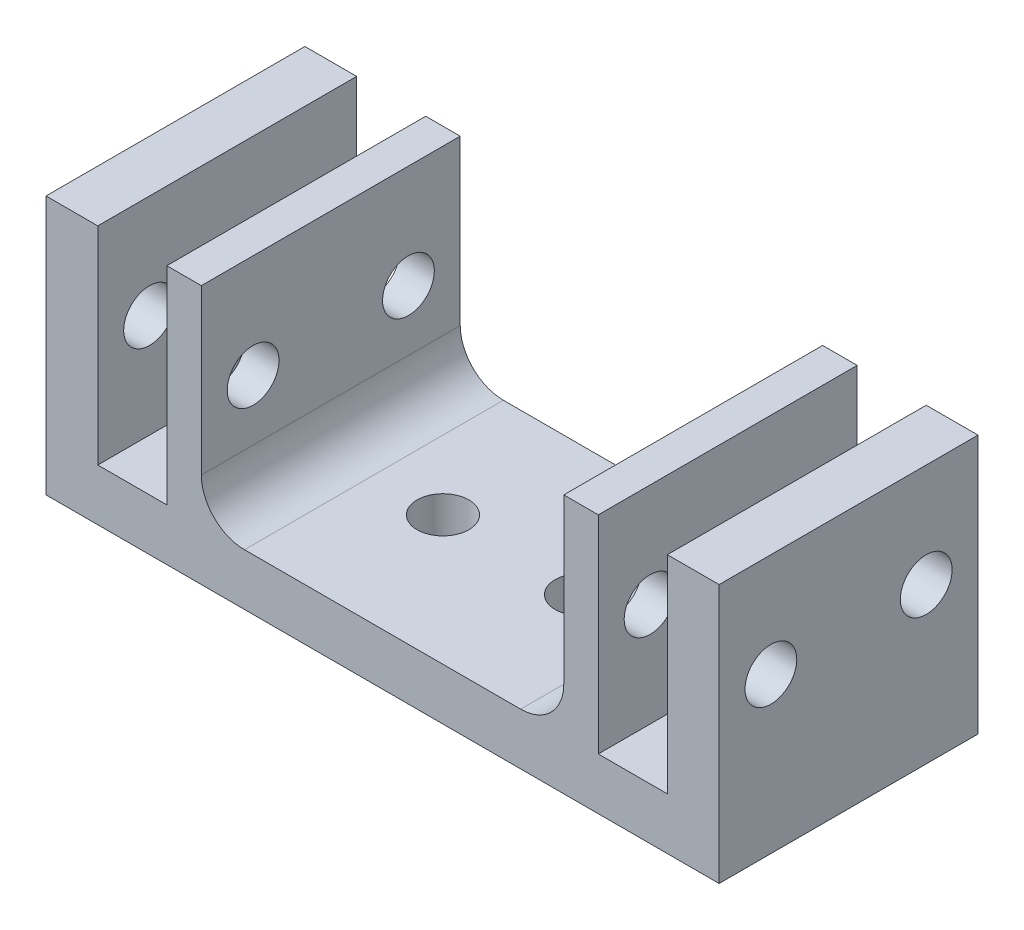
ISO-10303-21;
HEADER;
FILE_DESCRIPTION(('STEP AP214'),'2;1');
FILE_NAME('part.step','',(''),(''),'','','');
FILE_SCHEMA(('AUTOMOTIVE_DESIGN { 1 0 10303 214 1 1 1 1 }'));
ENDSEC;
DATA;
#1=APPLICATION_CONTEXT('core data for automotive mechanical design processes');
#2=APPLICATION_PROTOCOL_DEFINITION('international standard','automotive_design',2000,#1);
#3=PRODUCT_CONTEXT('',#1,'mechanical');
#4=PRODUCT('Part','Part','',(#3));
#5=PRODUCT_RELATED_PRODUCT_CATEGORY('part','',(#4));
#6=PRODUCT_DEFINITION_FORMATION('','',#4);
#7=PRODUCT_DEFINITION_CONTEXT('part definition',#1,'design');
#8=PRODUCT_DEFINITION('design','',#6,#7);
#9=PRODUCT_DEFINITION_SHAPE('','',#8);
#10=(LENGTH_UNIT() NAMED_UNIT(*) SI_UNIT(.MILLI.,.METRE.));
#11=(NAMED_UNIT(*) PLANE_ANGLE_UNIT() SI_UNIT($,.RADIAN.));
#12=(NAMED_UNIT(*) SI_UNIT($,.STERADIAN.) SOLID_ANGLE_UNIT());
#13=UNCERTAINTY_MEASURE_WITH_UNIT(LENGTH_MEASURE(1.E-05),#10,'distance_accuracy_value','');
#14=(GEOMETRIC_REPRESENTATION_CONTEXT(3) GLOBAL_UNCERTAINTY_ASSIGNED_CONTEXT((#13)) GLOBAL_UNIT_ASSIGNED_CONTEXT((#10,
#11,#12)) REPRESENTATION_CONTEXT('',''));
#15=CARTESIAN_POINT('',(0.,0.,0.));
#16=DIRECTION('',(0.,0.,1.));
#17=DIRECTION('',(1.,0.,0.));
#18=AXIS2_PLACEMENT_3D('',#15,#16,#17);
#19=CARTESIAN_POINT('',(-19.5,0.,15.));
#20=DIRECTION('',(1.,0.,0.));
#21=DIRECTION('',(0.,0.,-1.));
#22=AXIS2_PLACEMENT_3D('',#19,#20,#21);
#23=PLANE('',#22);
#24=CARTESIAN_POINT('',(-19.5,9.00000000000001,12.));
#25=DIRECTION('',(1.,0.,0.));
#26=DIRECTION('',(0.,1.,0.));
#27=AXIS2_PLACEMENT_3D('',#24,#25,#26);
#28=CIRCLE('',#27,1.5);
#29=CARTESIAN_POINT('',(-19.5,10.5,12.));
#30=VERTEX_POINT('',#29);
#31=EDGE_CURVE('E205',#30,#30,#28,.T.);
#32=ORIENTED_EDGE('',*,*,#31,.T.);
#33=EDGE_LOOP('',(#32));
#34=FACE_BOUND('',#33,.T.);
#35=CARTESIAN_POINT('',(-19.5,9.00000000000001,3.));
#36=DIRECTION('',(1.,0.,0.));
#37=DIRECTION('',(0.,-1.,0.));
#38=AXIS2_PLACEMENT_3D('',#35,#36,#37);
#39=CIRCLE('',#38,1.5);
#40=CARTESIAN_POINT('',(-19.5,7.50000000000001,3.));
#41=VERTEX_POINT('',#40);
#42=EDGE_CURVE('E552',#41,#41,#39,.T.);
#43=ORIENTED_EDGE('',*,*,#42,.T.);
#44=EDGE_LOOP('',(#43));
#45=FACE_BOUND('',#44,.T.);
#46=DIRECTION('',(0.,-1.,0.));
#47=VECTOR('',#46,1.);
#48=CARTESIAN_POINT('',(-19.5,0.,0.));
#49=LINE('',#48,#47);
#50=CARTESIAN_POINT('',(-19.5,15.,0.));
#51=VERTEX_POINT('',#50);
#52=CARTESIAN_POINT('',(-19.5,0.,0.));
#53=VERTEX_POINT('',#52);
#54=EDGE_CURVE('E188',#51,#53,#49,.T.);
#55=ORIENTED_EDGE('',*,*,#54,.T.);
#56=DIRECTION('',(0.,0.,-1.));
#57=VECTOR('',#56,1.);
#58=CARTESIAN_POINT('',(-19.5,0.,15.));
#59=LINE('',#58,#57);
#60=CARTESIAN_POINT('',(-19.5,0.,15.));
#61=VERTEX_POINT('',#60);
#62=EDGE_CURVE('E168',#61,#53,#59,.T.);
#63=ORIENTED_EDGE('',*,*,#62,.F.);
#64=DIRECTION('',(0.,-1.,0.));
#65=VECTOR('',#64,1.);
#66=CARTESIAN_POINT('',(-19.5,0.,15.));
#67=LINE('',#66,#65);
#68=CARTESIAN_POINT('',(-19.5,15.,15.));
#69=VERTEX_POINT('',#68);
#70=EDGE_CURVE('E175',#69,#61,#67,.T.);
#71=ORIENTED_EDGE('',*,*,#70,.F.);
#72=DIRECTION('',(0.,0.,-1.));
#73=VECTOR('',#72,1.);
#74=CARTESIAN_POINT('',(-19.5,15.,15.));
#75=LINE('',#74,#73);
#76=EDGE_CURVE('E271',#69,#51,#75,.T.);
#77=ORIENTED_EDGE('',*,*,#76,.T.);
#78=EDGE_LOOP('',(#55,#63,#71,#77));
#79=FACE_BOUND('',#78,.T.);
#80=ADVANCED_FACE('F39',(#34,#45,#79),#23,.F.);
#81=CARTESIAN_POINT('',(19.5,0.,15.));
#82=DIRECTION('',(0.,1.,0.));
#83=DIRECTION('',(0.,0.,1.));
#84=AXIS2_PLACEMENT_3D('',#81,#82,#83);
#85=PLANE('',#84);
#86=CARTESIAN_POINT('',(-4.,0.,7.5));
#87=DIRECTION('',(0.,1.,0.));
#88=DIRECTION('',(0.,0.,1.));
#89=AXIS2_PLACEMENT_3D('',#86,#87,#88);
#90=CIRCLE('',#89,1.5);
#91=CARTESIAN_POINT('',(-4.,0.,9.));
#92=VERTEX_POINT('',#91);
#93=EDGE_CURVE('E275',#92,#92,#90,.T.);
#94=ORIENTED_EDGE('',*,*,#93,.T.);
#95=EDGE_LOOP('',(#94));
#96=FACE_BOUND('',#95,.T.);
#97=CARTESIAN_POINT('',(4.,0.,7.5));
#98=DIRECTION('',(0.,1.,0.));
#99=DIRECTION('',(0.,0.,1.));
#100=AXIS2_PLACEMENT_3D('',#97,#98,#99);
#101=CIRCLE('',#100,1.5);
#102=CARTESIAN_POINT('',(4.,0.,9.));
#103=VERTEX_POINT('',#102);
#104=EDGE_CURVE('E501',#103,#103,#101,.T.);
#105=ORIENTED_EDGE('',*,*,#104,.T.);
#106=EDGE_LOOP('',(#105));
#107=FACE_BOUND('',#106,.T.);
#108=DIRECTION('',(1.,0.,0.));
#109=VECTOR('',#108,1.);
#110=CARTESIAN_POINT('',(19.5,0.,0.));
#111=LINE('',#110,#109);
#112=CARTESIAN_POINT('',(19.5,0.,0.));
#113=VERTEX_POINT('',#112);
#114=EDGE_CURVE('E274',#53,#113,#111,.T.);
#115=ORIENTED_EDGE('',*,*,#114,.T.);
#116=DIRECTION('',(0.,0.,-1.));
#117=VECTOR('',#116,1.);
#118=CARTESIAN_POINT('',(19.5,0.,15.));
#119=LINE('',#118,#117);
#120=CARTESIAN_POINT('',(19.5,0.,15.));
#121=VERTEX_POINT('',#120);
#122=EDGE_CURVE('E171',#121,#113,#119,.T.);
#123=ORIENTED_EDGE('',*,*,#122,.F.);
#124=DIRECTION('',(1.,0.,0.));
#125=VECTOR('',#124,1.);
#126=CARTESIAN_POINT('',(19.5,0.,15.));
#127=LINE('',#126,#125);
#128=EDGE_CURVE('E164',#61,#121,#127,.T.);
#129=ORIENTED_EDGE('',*,*,#128,.F.);
#130=ORIENTED_EDGE('',*,*,#62,.T.);
#131=EDGE_LOOP('',(#115,#123,#129,#130));
#132=FACE_BOUND('',#131,.T.);
#133=ADVANCED_FACE('F166',(#96,#107,#132),#85,.F.);
#134=CARTESIAN_POINT('',(19.5,0.,15.));
#135=DIRECTION('',(-1.,0.,0.));
#136=DIRECTION('',(0.,0.,1.));
#137=AXIS2_PLACEMENT_3D('',#134,#135,#136);
#138=PLANE('',#137);
#139=CARTESIAN_POINT('',(19.5,9.,12.));
#140=DIRECTION('',(1.,0.,0.));
#141=DIRECTION('',(0.,1.,0.));
#142=AXIS2_PLACEMENT_3D('',#139,#140,#141);
#143=CIRCLE('',#142,1.5);
#144=CARTESIAN_POINT('',(19.5,10.5,12.));
#145=VERTEX_POINT('',#144);
#146=EDGE_CURVE('E556',#145,#145,#143,.T.);
#147=ORIENTED_EDGE('',*,*,#146,.F.);
#148=EDGE_LOOP('',(#147));
#149=FACE_BOUND('',#148,.T.);
#150=CARTESIAN_POINT('',(19.5,9.,3.));
#151=DIRECTION('',(1.,0.,0.));
#152=DIRECTION('',(0.,-1.,0.));
#153=AXIS2_PLACEMENT_3D('',#150,#151,#152);
#154=CIRCLE('',#153,1.5);
#155=CARTESIAN_POINT('',(19.5,7.5,3.));
#156=VERTEX_POINT('',#155);
#157=EDGE_CURVE('E548',#156,#156,#154,.T.);
#158=ORIENTED_EDGE('',*,*,#157,.F.);
#159=EDGE_LOOP('',(#158));
#160=FACE_BOUND('',#159,.T.);
#161=DIRECTION('',(0.,1.,0.));
#162=VECTOR('',#161,1.);
#163=CARTESIAN_POINT('',(19.5,0.,0.));
#164=LINE('',#163,#162);
#165=CARTESIAN_POINT('',(19.5,15.,0.));
#166=VERTEX_POINT('',#165);
#167=EDGE_CURVE('E278',#113,#166,#164,.T.);
#168=ORIENTED_EDGE('',*,*,#167,.T.);
#169=DIRECTION('',(0.,0.,-1.));
#170=VECTOR('',#169,1.);
#171=CARTESIAN_POINT('',(19.5,15.,15.));
#172=LINE('',#171,#170);
#173=CARTESIAN_POINT('',(19.5,15.,15.));
#174=VERTEX_POINT('',#173);
#175=EDGE_CURVE('E196',#174,#166,#172,.T.);
#176=ORIENTED_EDGE('',*,*,#175,.F.);
#177=DIRECTION('',(0.,1.,0.));
#178=VECTOR('',#177,1.);
#179=CARTESIAN_POINT('',(19.5,0.,15.));
#180=LINE('',#179,#178);
#181=EDGE_CURVE('E174',#121,#174,#180,.T.);
#182=ORIENTED_EDGE('',*,*,#181,.F.);
#183=ORIENTED_EDGE('',*,*,#122,.T.);
#184=EDGE_LOOP('',(#168,#176,#182,#183));
#185=FACE_BOUND('',#184,.T.);
#186=ADVANCED_FACE('F425',(#149,#160,#185),#138,.F.);
#187=CARTESIAN_POINT('',(19.5,15.,15.));
#188=DIRECTION('',(0.,-1.,0.));
#189=DIRECTION('',(1.,0.,0.));
#190=AXIS2_PLACEMENT_3D('',#187,#188,#189);
#191=PLANE('',#190);
#192=DIRECTION('',(-1.,0.,0.));
#193=VECTOR('',#192,1.);
#194=CARTESIAN_POINT('',(19.5,15.,0.));
#195=LINE('',#194,#193);
#196=CARTESIAN_POINT('',(16.5,15.,0.));
#197=VERTEX_POINT('',#196);
#198=EDGE_CURVE('E281',#166,#197,#195,.T.);
#199=ORIENTED_EDGE('',*,*,#198,.T.);
#200=DIRECTION('',(0.,0.,-1.));
#201=VECTOR('',#200,1.);
#202=CARTESIAN_POINT('',(16.5,15.,15.));
#203=LINE('',#202,#201);
#204=CARTESIAN_POINT('',(16.5,15.,15.));
#205=VERTEX_POINT('',#204);
#206=EDGE_CURVE('E351',#205,#197,#203,.T.);
#207=ORIENTED_EDGE('',*,*,#206,.F.);
#208=DIRECTION('',(-1.,0.,0.));
#209=VECTOR('',#208,1.);
#210=CARTESIAN_POINT('',(19.5,15.,15.));
#211=LINE('',#210,#209);
#212=EDGE_CURVE('E362',#174,#205,#211,.T.);
#213=ORIENTED_EDGE('',*,*,#212,.F.);
#214=ORIENTED_EDGE('',*,*,#175,.T.);
#215=EDGE_LOOP('',(#199,#207,#213,#214));
#216=FACE_BOUND('',#215,.T.);
#217=ADVANCED_FACE('F360',(#216),#191,.F.);
#218=CARTESIAN_POINT('',(16.5,15.,15.));
#219=DIRECTION('',(1.,0.,0.));
#220=DIRECTION('',(0.,1.,0.));
#221=AXIS2_PLACEMENT_3D('',#218,#219,#220);
#222=PLANE('',#221);
#223=CARTESIAN_POINT('',(16.5,9.,12.));
#224=DIRECTION('',(1.,0.,0.));
#225=DIRECTION('',(0.,1.,0.));
#226=AXIS2_PLACEMENT_3D('',#223,#224,#225);
#227=CIRCLE('',#226,1.5);
#228=CARTESIAN_POINT('',(16.5,10.5,12.));
#229=VERTEX_POINT('',#228);
#230=EDGE_CURVE('E492',#229,#229,#227,.T.);
#231=ORIENTED_EDGE('',*,*,#230,.T.);
#232=EDGE_LOOP('',(#231));
#233=FACE_BOUND('',#232,.T.);
#234=CARTESIAN_POINT('',(16.5,9.,3.));
#235=DIRECTION('',(1.,0.,0.));
#236=DIRECTION('',(0.,1.,0.));
#237=AXIS2_PLACEMENT_3D('',#234,#235,#236);
#238=CIRCLE('',#237,1.5);
#239=CARTESIAN_POINT('',(16.5,10.5,3.));
#240=VERTEX_POINT('',#239);
#241=EDGE_CURVE('E210',#240,#240,#238,.T.);
#242=ORIENTED_EDGE('',*,*,#241,.T.);
#243=EDGE_LOOP('',(#242));
#244=FACE_BOUND('',#243,.T.);
#245=DIRECTION('',(0.,-1.,0.));
#246=VECTOR('',#245,1.);
#247=CARTESIAN_POINT('',(16.5,15.,0.));
#248=LINE('',#247,#246);
#249=CARTESIAN_POINT('',(16.5,3.,0.));
#250=VERTEX_POINT('',#249);
#251=EDGE_CURVE('E284',#197,#250,#248,.T.);
#252=ORIENTED_EDGE('',*,*,#251,.T.);
#253=DIRECTION('',(0.,0.,-1.));
#254=VECTOR('',#253,1.);
#255=CARTESIAN_POINT('',(16.5,3.,15.));
#256=LINE('',#255,#254);
#257=CARTESIAN_POINT('',(16.5,3.,15.));
#258=VERTEX_POINT('',#257);
#259=EDGE_CURVE('E347',#258,#250,#256,.T.);
#260=ORIENTED_EDGE('',*,*,#259,.F.);
#261=DIRECTION('',(0.,-1.,0.));
#262=VECTOR('',#261,1.);
#263=CARTESIAN_POINT('',(16.5,15.,15.));
#264=LINE('',#263,#262);
#265=EDGE_CURVE('E380',#205,#258,#264,.T.);
#266=ORIENTED_EDGE('',*,*,#265,.F.);
#267=ORIENTED_EDGE('',*,*,#206,.T.);
#268=EDGE_LOOP('',(#252,#260,#266,#267));
#269=FACE_BOUND('',#268,.T.);
#270=ADVANCED_FACE('F370',(#233,#244,#269),#222,.F.);
#271=CARTESIAN_POINT('',(16.5,3.,15.));
#272=DIRECTION('',(0.,-1.,0.));
#273=DIRECTION('',(1.,0.,0.));
#274=AXIS2_PLACEMENT_3D('',#271,#272,#273);
#275=PLANE('',#274);
#276=DIRECTION('',(-1.,0.,0.));
#277=VECTOR('',#276,1.);
#278=CARTESIAN_POINT('',(16.5,3.,0.));
#279=LINE('',#278,#277);
#280=CARTESIAN_POINT('',(12.5,3.,0.));
#281=VERTEX_POINT('',#280);
#282=EDGE_CURVE('E287',#250,#281,#279,.T.);
#283=ORIENTED_EDGE('',*,*,#282,.T.);
#284=DIRECTION('',(0.,0.,-1.));
#285=VECTOR('',#284,1.);
#286=CARTESIAN_POINT('',(12.5,3.,15.));
#287=LINE('',#286,#285);
#288=CARTESIAN_POINT('',(12.5,3.,15.));
#289=VERTEX_POINT('',#288);
#290=EDGE_CURVE('E343',#289,#281,#287,.T.);
#291=ORIENTED_EDGE('',*,*,#290,.F.);
#292=DIRECTION('',(-1.,0.,0.));
#293=VECTOR('',#292,1.);
#294=CARTESIAN_POINT('',(16.5,3.,15.));
#295=LINE('',#294,#293);
#296=EDGE_CURVE('E376',#258,#289,#295,.T.);
#297=ORIENTED_EDGE('',*,*,#296,.F.);
#298=ORIENTED_EDGE('',*,*,#259,.T.);
#299=EDGE_LOOP('',(#283,#291,#297,#298));
#300=FACE_BOUND('',#299,.T.);
#301=ADVANCED_FACE('F374',(#300),#275,.F.);
#302=CARTESIAN_POINT('',(12.5,3.,15.));
#303=DIRECTION('',(-1.,0.,0.));
#304=DIRECTION('',(0.,0.,1.));
#305=AXIS2_PLACEMENT_3D('',#302,#303,#304);
#306=PLANE('',#305);
#307=CARTESIAN_POINT('',(12.5,9.,12.));
#308=DIRECTION('',(-1.,0.,0.));
#309=DIRECTION('',(0.,0.,1.));
#310=AXIS2_PLACEMENT_3D('',#307,#308,#309);
#311=CIRCLE('',#310,1.5);
#312=CARTESIAN_POINT('',(12.5,9.,13.5));
#313=VERTEX_POINT('',#312);
#314=EDGE_CURVE('E485',#313,#313,#311,.T.);
#315=ORIENTED_EDGE('',*,*,#314,.T.);
#316=EDGE_LOOP('',(#315));
#317=FACE_BOUND('',#316,.T.);
#318=CARTESIAN_POINT('',(12.5,9.,3.));
#319=DIRECTION('',(-1.,0.,0.));
#320=DIRECTION('',(0.,0.,1.));
#321=AXIS2_PLACEMENT_3D('',#318,#319,#320);
#322=CIRCLE('',#321,1.5);
#323=CARTESIAN_POINT('',(12.5,9.,4.5));
#324=VERTEX_POINT('',#323);
#325=EDGE_CURVE('E532',#324,#324,#322,.T.);
#326=ORIENTED_EDGE('',*,*,#325,.T.);
#327=EDGE_LOOP('',(#326));
#328=FACE_BOUND('',#327,.T.);
#329=DIRECTION('',(0.,1.,0.));
#330=VECTOR('',#329,1.);
#331=CARTESIAN_POINT('',(12.5,3.,0.));
#332=LINE('',#331,#330);
#333=CARTESIAN_POINT('',(12.5,15.,0.));
#334=VERTEX_POINT('',#333);
#335=EDGE_CURVE('E290',#281,#334,#332,.T.);
#336=ORIENTED_EDGE('',*,*,#335,.T.);
#337=DIRECTION('',(0.,0.,-1.));
#338=VECTOR('',#337,1.);
#339=CARTESIAN_POINT('',(12.5,15.,15.));
#340=LINE('',#339,#338);
#341=CARTESIAN_POINT('',(12.5,15.,15.));
#342=VERTEX_POINT('',#341);
#343=EDGE_CURVE('E339',#342,#334,#340,.T.);
#344=ORIENTED_EDGE('',*,*,#343,.F.);
#345=DIRECTION('',(0.,1.,0.));
#346=VECTOR('',#345,1.);
#347=CARTESIAN_POINT('',(12.5,3.,15.));
#348=LINE('',#347,#346);
#349=EDGE_CURVE('E379',#289,#342,#348,.T.);
#350=ORIENTED_EDGE('',*,*,#349,.F.);
#351=ORIENTED_EDGE('',*,*,#290,.T.);
#352=EDGE_LOOP('',(#336,#344,#350,#351));
#353=FACE_BOUND('',#352,.T.);
#354=ADVANCED_FACE('F407',(#317,#328,#353),#306,.F.);
#355=CARTESIAN_POINT('',(12.5,15.,15.));
#356=DIRECTION('',(0.,-1.,0.));
#357=DIRECTION('',(1.,0.,0.));
#358=AXIS2_PLACEMENT_3D('',#355,#356,#357);
#359=PLANE('',#358);
#360=DIRECTION('',(-1.,0.,0.));
#361=VECTOR('',#360,1.);
#362=CARTESIAN_POINT('',(12.5,15.,0.));
#363=LINE('',#362,#361);
#364=CARTESIAN_POINT('',(10.5,15.,0.));
#365=VERTEX_POINT('',#364);
#366=EDGE_CURVE('E293',#334,#365,#363,.T.);
#367=ORIENTED_EDGE('',*,*,#366,.T.);
#368=DIRECTION('',(0.,0.,-1.));
#369=VECTOR('',#368,1.);
#370=CARTESIAN_POINT('',(10.5,15.,15.));
#371=LINE('',#370,#369);
#372=CARTESIAN_POINT('',(10.5,15.,15.));
#373=VERTEX_POINT('',#372);
#374=EDGE_CURVE('E335',#373,#365,#371,.T.);
#375=ORIENTED_EDGE('',*,*,#374,.F.);
#376=DIRECTION('',(-1.,0.,0.));
#377=VECTOR('',#376,1.);
#378=CARTESIAN_POINT('',(12.5,15.,15.));
#379=LINE('',#378,#377);
#380=EDGE_CURVE('E384',#342,#373,#379,.T.);
#381=ORIENTED_EDGE('',*,*,#380,.F.);
#382=ORIENTED_EDGE('',*,*,#343,.T.);
#383=EDGE_LOOP('',(#367,#375,#381,#382));
#384=FACE_BOUND('',#383,.T.);
#385=ADVANCED_FACE('F404',(#384),#359,.F.);
#386=CARTESIAN_POINT('',(10.5,15.,15.));
#387=DIRECTION('',(1.,0.,0.));
#388=DIRECTION('',(0.,1.,0.));
#389=AXIS2_PLACEMENT_3D('',#386,#387,#388);
#390=PLANE('',#389);
#391=CARTESIAN_POINT('',(10.5,9.,12.));
#392=DIRECTION('',(1.,0.,0.));
#393=DIRECTION('',(0.,1.,0.));
#394=AXIS2_PLACEMENT_3D('',#391,#392,#393);
#395=CIRCLE('',#394,1.5);
#396=CARTESIAN_POINT('',(10.5,10.5,12.));
#397=VERTEX_POINT('',#396);
#398=EDGE_CURVE('E480',#397,#397,#395,.T.);
#399=ORIENTED_EDGE('',*,*,#398,.T.);
#400=EDGE_LOOP('',(#399));
#401=FACE_BOUND('',#400,.T.);
#402=CARTESIAN_POINT('',(10.5,9.,3.));
#403=DIRECTION('',(1.,0.,0.));
#404=DIRECTION('',(0.,1.,0.));
#405=AXIS2_PLACEMENT_3D('',#402,#403,#404);
#406=CIRCLE('',#405,1.5);
#407=CARTESIAN_POINT('',(10.5,10.5,3.));
#408=VERTEX_POINT('',#407);
#409=EDGE_CURVE('E535',#408,#408,#406,.T.);
#410=ORIENTED_EDGE('',*,*,#409,.T.);
#411=EDGE_LOOP('',(#410));
#412=FACE_BOUND('',#411,.T.);
#413=DIRECTION('',(0.,-1.,0.));
#414=VECTOR('',#413,1.);
#415=CARTESIAN_POINT('',(10.5,15.,0.));
#416=LINE('',#415,#414);
#417=CARTESIAN_POINT('',(10.5,5.5,0.));
#418=VERTEX_POINT('',#417);
#419=EDGE_CURVE('E240',#365,#418,#416,.T.);
#420=ORIENTED_EDGE('',*,*,#419,.T.);
#421=DIRECTION('',(0.,0.,-1.));
#422=VECTOR('',#421,1.);
#423=CARTESIAN_POINT('',(10.5,5.5,15.));
#424=LINE('',#423,#422);
#425=CARTESIAN_POINT('',(10.5,5.5,15.));
#426=VERTEX_POINT('',#425);
#427=EDGE_CURVE('E215',#418,#426,#424,.F.);
#428=ORIENTED_EDGE('',*,*,#427,.T.);
#429=DIRECTION('',(0.,-1.,0.));
#430=VECTOR('',#429,1.);
#431=CARTESIAN_POINT('',(10.5,15.,15.));
#432=LINE('',#431,#430);
#433=EDGE_CURVE('E257',#373,#426,#432,.T.);
#434=ORIENTED_EDGE('',*,*,#433,.F.);
#435=ORIENTED_EDGE('',*,*,#374,.T.);
#436=EDGE_LOOP('',(#420,#428,#434,#435));
#437=FACE_BOUND('',#436,.T.);
#438=ADVANCED_FACE('F402',(#401,#412,#437),#390,.F.);
#439=CARTESIAN_POINT('',(-10.5,3.,15.));
#440=DIRECTION('',(0.,-1.,0.));
#441=DIRECTION('',(0.,0.,-1.));
#442=AXIS2_PLACEMENT_3D('',#439,#440,#441);
#443=PLANE('',#442);
#444=CARTESIAN_POINT('',(-4.,3.,7.5));
#445=DIRECTION('',(0.,1.,0.));
#446=DIRECTION('',(0.,0.,1.));
#447=AXIS2_PLACEMENT_3D('',#444,#445,#446);
#448=CIRCLE('',#447,1.5);
#449=CARTESIAN_POINT('',(-4.,3.,9.));
#450=VERTEX_POINT('',#449);
#451=EDGE_CURVE('E497',#450,#450,#448,.T.);
#452=ORIENTED_EDGE('',*,*,#451,.F.);
#453=EDGE_LOOP('',(#452));
#454=FACE_BOUND('',#453,.T.);
#455=CARTESIAN_POINT('',(4.,3.,7.5));
#456=DIRECTION('',(0.,1.,0.));
#457=DIRECTION('',(0.,0.,-1.));
#458=AXIS2_PLACEMENT_3D('',#455,#456,#457);
#459=CIRCLE('',#458,1.5);
#460=CARTESIAN_POINT('',(4.,3.,6.));
#461=VERTEX_POINT('',#460);
#462=EDGE_CURVE('E496',#461,#461,#459,.T.);
#463=ORIENTED_EDGE('',*,*,#462,.F.);
#464=EDGE_LOOP('',(#463));
#465=FACE_BOUND('',#464,.T.);
#466=DIRECTION('',(-1.,0.,0.));
#467=VECTOR('',#466,1.);
#468=CARTESIAN_POINT('',(-10.5,3.,15.));
#469=LINE('',#468,#467);
#470=CARTESIAN_POINT('',(8.,3.,15.));
#471=VERTEX_POINT('',#470);
#472=CARTESIAN_POINT('',(-8.,3.,15.));
#473=VERTEX_POINT('',#472);
#474=EDGE_CURVE('E251',#471,#473,#469,.T.);
#475=ORIENTED_EDGE('',*,*,#474,.F.);
#476=DIRECTION('',(0.,0.,-1.));
#477=VECTOR('',#476,1.);
#478=CARTESIAN_POINT('',(8.,3.,0.));
#479=LINE('',#478,#477);
#480=CARTESIAN_POINT('',(8.,3.,0.));
#481=VERTEX_POINT('',#480);
#482=EDGE_CURVE('E194',#471,#481,#479,.T.);
#483=ORIENTED_EDGE('',*,*,#482,.T.);
#484=DIRECTION('',(-1.,0.,0.));
#485=VECTOR('',#484,1.);
#486=CARTESIAN_POINT('',(-10.5,3.,0.));
#487=LINE('',#486,#485);
#488=CARTESIAN_POINT('',(-8.,3.,0.));
#489=VERTEX_POINT('',#488);
#490=EDGE_CURVE('E232',#481,#489,#487,.T.);
#491=ORIENTED_EDGE('',*,*,#490,.T.);
#492=DIRECTION('',(0.,0.,-1.));
#493=VECTOR('',#492,1.);
#494=CARTESIAN_POINT('',(-8.,3.,15.));
#495=LINE('',#494,#493);
#496=EDGE_CURVE('E190',#489,#473,#495,.F.);
#497=ORIENTED_EDGE('',*,*,#496,.T.);
#498=EDGE_LOOP('',(#475,#483,#491,#497));
#499=FACE_BOUND('',#498,.T.);
#500=ADVANCED_FACE('F237',(#454,#465,#499),#443,.F.);
#501=CARTESIAN_POINT('',(-10.5,15.,15.));
#502=DIRECTION('',(-1.,0.,0.));
#503=DIRECTION('',(0.,-1.,0.));
#504=AXIS2_PLACEMENT_3D('',#501,#502,#503);
#505=PLANE('',#504);
#506=CARTESIAN_POINT('',(-10.5,9.,12.));
#507=DIRECTION('',(-1.,0.,0.));
#508=DIRECTION('',(0.,-1.,0.));
#509=AXIS2_PLACEMENT_3D('',#506,#507,#508);
#510=CIRCLE('',#509,1.5);
#511=CARTESIAN_POINT('',(-10.5,7.50000000000001,12.));
#512=VERTEX_POINT('',#511);
#513=EDGE_CURVE('E477',#512,#512,#510,.T.);
#514=ORIENTED_EDGE('',*,*,#513,.T.);
#515=EDGE_LOOP('',(#514));
#516=FACE_BOUND('',#515,.T.);
#517=CARTESIAN_POINT('',(-10.5,9.00000000000001,3.));
#518=DIRECTION('',(-1.,0.,0.));
#519=DIRECTION('',(0.,-1.,0.));
#520=AXIS2_PLACEMENT_3D('',#517,#518,#519);
#521=CIRCLE('',#520,1.5);
#522=CARTESIAN_POINT('',(-10.5,7.50000000000001,3.));
#523=VERTEX_POINT('',#522);
#524=EDGE_CURVE('E541',#523,#523,#521,.T.);
#525=ORIENTED_EDGE('',*,*,#524,.T.);
#526=EDGE_LOOP('',(#525));
#527=FACE_BOUND('',#526,.T.);
#528=DIRECTION('',(0.,1.,0.));
#529=VECTOR('',#528,1.);
#530=CARTESIAN_POINT('',(-10.5,15.,15.));
#531=LINE('',#530,#529);
#532=CARTESIAN_POINT('',(-10.5,5.5,15.));
#533=VERTEX_POINT('',#532);
#534=CARTESIAN_POINT('',(-10.5,15.,15.));
#535=VERTEX_POINT('',#534);
#536=EDGE_CURVE('E246',#533,#535,#531,.T.);
#537=ORIENTED_EDGE('',*,*,#536,.F.);
#538=DIRECTION('',(0.,0.,-1.));
#539=VECTOR('',#538,1.);
#540=CARTESIAN_POINT('',(-10.5,5.5,0.));
#541=LINE('',#540,#539);
#542=CARTESIAN_POINT('',(-10.5,5.5,0.));
#543=VERTEX_POINT('',#542);
#544=EDGE_CURVE('E218',#533,#543,#541,.T.);
#545=ORIENTED_EDGE('',*,*,#544,.T.);
#546=DIRECTION('',(0.,1.,0.));
#547=VECTOR('',#546,1.);
#548=CARTESIAN_POINT('',(-10.5,15.,0.));
#549=LINE('',#548,#547);
#550=CARTESIAN_POINT('',(-10.5,15.,0.));
#551=VERTEX_POINT('',#550);
#552=EDGE_CURVE('E234',#543,#551,#549,.T.);
#553=ORIENTED_EDGE('',*,*,#552,.T.);
#554=DIRECTION('',(0.,0.,-1.));
#555=VECTOR('',#554,1.);
#556=CARTESIAN_POINT('',(-10.5,15.,15.));
#557=LINE('',#556,#555);
#558=EDGE_CURVE('E247',#535,#551,#557,.T.);
#559=ORIENTED_EDGE('',*,*,#558,.F.);
#560=EDGE_LOOP('',(#537,#545,#553,#559));
#561=FACE_BOUND('',#560,.T.);
#562=ADVANCED_FACE('F243',(#516,#527,#561),#505,.F.);
#563=CARTESIAN_POINT('',(-12.5,15.,15.));
#564=DIRECTION('',(0.,-1.,0.));
#565=DIRECTION('',(1.,0.,0.));
#566=AXIS2_PLACEMENT_3D('',#563,#564,#565);
#567=PLANE('',#566);
#568=DIRECTION('',(-1.,0.,0.));
#569=VECTOR('',#568,1.);
#570=CARTESIAN_POINT('',(-12.5,15.,0.));
#571=LINE('',#570,#569);
#572=CARTESIAN_POINT('',(-12.5,15.,0.));
#573=VERTEX_POINT('',#572);
#574=EDGE_CURVE('E301',#551,#573,#571,.T.);
#575=ORIENTED_EDGE('',*,*,#574,.T.);
#576=DIRECTION('',(0.,0.,-1.));
#577=VECTOR('',#576,1.);
#578=CARTESIAN_POINT('',(-12.5,15.,15.));
#579=LINE('',#578,#577);
#580=CARTESIAN_POINT('',(-12.5,15.,15.));
#581=VERTEX_POINT('',#580);
#582=EDGE_CURVE('E329',#581,#573,#579,.T.);
#583=ORIENTED_EDGE('',*,*,#582,.F.);
#584=DIRECTION('',(-1.,0.,0.));
#585=VECTOR('',#584,1.);
#586=CARTESIAN_POINT('',(-12.5,15.,15.));
#587=LINE('',#586,#585);
#588=EDGE_CURVE('E250',#535,#581,#587,.T.);
#589=ORIENTED_EDGE('',*,*,#588,.F.);
#590=ORIENTED_EDGE('',*,*,#558,.T.);
#591=EDGE_LOOP('',(#575,#583,#589,#590));
#592=FACE_BOUND('',#591,.T.);
#593=ADVANCED_FACE('F592',(#592),#567,.F.);
#594=CARTESIAN_POINT('',(-12.5,3.,15.));
#595=DIRECTION('',(1.,0.,0.));
#596=DIRECTION('',(0.,0.,-1.));
#597=AXIS2_PLACEMENT_3D('',#594,#595,#596);
#598=PLANE('',#597);
#599=CARTESIAN_POINT('',(-12.5,9.,12.));
#600=DIRECTION('',(1.,0.,0.));
#601=DIRECTION('',(0.,0.,-1.));
#602=AXIS2_PLACEMENT_3D('',#599,#600,#601);
#603=CIRCLE('',#602,1.5);
#604=CARTESIAN_POINT('',(-12.5,9.,10.5));
#605=VERTEX_POINT('',#604);
#606=EDGE_CURVE('E209',#605,#605,#603,.T.);
#607=ORIENTED_EDGE('',*,*,#606,.T.);
#608=EDGE_LOOP('',(#607));
#609=FACE_BOUND('',#608,.T.);
#610=CARTESIAN_POINT('',(-12.5,9.00000000000001,3.));
#611=DIRECTION('',(1.,0.,0.));
#612=DIRECTION('',(0.,0.,-1.));
#613=AXIS2_PLACEMENT_3D('',#610,#611,#612);
#614=CIRCLE('',#613,1.5);
#615=CARTESIAN_POINT('',(-12.5,9.00000000000001,1.5));
#616=VERTEX_POINT('',#615);
#617=EDGE_CURVE('E204',#616,#616,#614,.T.);
#618=ORIENTED_EDGE('',*,*,#617,.T.);
#619=EDGE_LOOP('',(#618));
#620=FACE_BOUND('',#619,.T.);
#621=DIRECTION('',(0.,-1.,0.));
#622=VECTOR('',#621,1.);
#623=CARTESIAN_POINT('',(-12.5,3.,0.));
#624=LINE('',#623,#622);
#625=CARTESIAN_POINT('',(-12.5,3.,0.));
#626=VERTEX_POINT('',#625);
#627=EDGE_CURVE('E304',#573,#626,#624,.T.);
#628=ORIENTED_EDGE('',*,*,#627,.T.);
#629=DIRECTION('',(0.,0.,-1.));
#630=VECTOR('',#629,1.);
#631=CARTESIAN_POINT('',(-12.5,3.,15.));
#632=LINE('',#631,#630);
#633=CARTESIAN_POINT('',(-12.5,3.,15.));
#634=VERTEX_POINT('',#633);
#635=EDGE_CURVE('E325',#634,#626,#632,.T.);
#636=ORIENTED_EDGE('',*,*,#635,.F.);
#637=DIRECTION('',(0.,-1.,0.));
#638=VECTOR('',#637,1.);
#639=CARTESIAN_POINT('',(-12.5,3.,15.));
#640=LINE('',#639,#638);
#641=EDGE_CURVE('E255',#581,#634,#640,.T.);
#642=ORIENTED_EDGE('',*,*,#641,.F.);
#643=ORIENTED_EDGE('',*,*,#582,.T.);
#644=EDGE_LOOP('',(#628,#636,#642,#643));
#645=FACE_BOUND('',#644,.T.);
#646=ADVANCED_FACE('F588',(#609,#620,#645),#598,.F.);
#647=CARTESIAN_POINT('',(-16.5,3.,15.));
#648=DIRECTION('',(0.,-1.,0.));
#649=DIRECTION('',(1.,0.,0.));
#650=AXIS2_PLACEMENT_3D('',#647,#648,#649);
#651=PLANE('',#650);
#652=DIRECTION('',(-1.,0.,0.));
#653=VECTOR('',#652,1.);
#654=CARTESIAN_POINT('',(-16.5,3.,0.));
#655=LINE('',#654,#653);
#656=CARTESIAN_POINT('',(-16.5,3.,0.));
#657=VERTEX_POINT('',#656);
#658=EDGE_CURVE('E307',#626,#657,#655,.T.);
#659=ORIENTED_EDGE('',*,*,#658,.T.);
#660=DIRECTION('',(0.,0.,-1.));
#661=VECTOR('',#660,1.);
#662=CARTESIAN_POINT('',(-16.5,3.,15.));
#663=LINE('',#662,#661);
#664=CARTESIAN_POINT('',(-16.5,3.,15.));
#665=VERTEX_POINT('',#664);
#666=EDGE_CURVE('E321',#665,#657,#663,.T.);
#667=ORIENTED_EDGE('',*,*,#666,.F.);
#668=DIRECTION('',(-1.,0.,0.));
#669=VECTOR('',#668,1.);
#670=CARTESIAN_POINT('',(-16.5,3.,15.));
#671=LINE('',#670,#669);
#672=EDGE_CURVE('E263',#634,#665,#671,.T.);
#673=ORIENTED_EDGE('',*,*,#672,.F.);
#674=ORIENTED_EDGE('',*,*,#635,.T.);
#675=EDGE_LOOP('',(#659,#667,#673,#674));
#676=FACE_BOUND('',#675,.T.);
#677=ADVANCED_FACE('F568',(#676),#651,.F.);
#678=CARTESIAN_POINT('',(-16.5,15.,15.));
#679=DIRECTION('',(-1.,0.,0.));
#680=DIRECTION('',(0.,-1.,0.));
#681=AXIS2_PLACEMENT_3D('',#678,#679,#680);
#682=PLANE('',#681);
#683=CARTESIAN_POINT('',(-16.5,9.00000000000001,12.));
#684=DIRECTION('',(-1.,0.,0.));
#685=DIRECTION('',(0.,-1.,0.));
#686=AXIS2_PLACEMENT_3D('',#683,#684,#685);
#687=CIRCLE('',#686,1.5);
#688=CARTESIAN_POINT('',(-16.5,7.50000000000001,12.));
#689=VERTEX_POINT('',#688);
#690=EDGE_CURVE('E206',#689,#689,#687,.T.);
#691=ORIENTED_EDGE('',*,*,#690,.T.);
#692=EDGE_LOOP('',(#691));
#693=FACE_BOUND('',#692,.T.);
#694=CARTESIAN_POINT('',(-16.5,9.00000000000001,3.));
#695=DIRECTION('',(-1.,0.,0.));
#696=DIRECTION('',(0.,-1.,0.));
#697=AXIS2_PLACEMENT_3D('',#694,#695,#696);
#698=CIRCLE('',#697,1.5);
#699=CARTESIAN_POINT('',(-16.5,7.50000000000001,3.));
#700=VERTEX_POINT('',#699);
#701=EDGE_CURVE('E200',#700,#700,#698,.T.);
#702=ORIENTED_EDGE('',*,*,#701,.T.);
#703=EDGE_LOOP('',(#702));
#704=FACE_BOUND('',#703,.T.);
#705=DIRECTION('',(0.,1.,0.));
#706=VECTOR('',#705,1.);
#707=CARTESIAN_POINT('',(-16.5,15.,0.));
#708=LINE('',#707,#706);
#709=CARTESIAN_POINT('',(-16.5,15.,0.));
#710=VERTEX_POINT('',#709);
#711=EDGE_CURVE('E310',#657,#710,#708,.T.);
#712=ORIENTED_EDGE('',*,*,#711,.T.);
#713=DIRECTION('',(0.,0.,-1.));
#714=VECTOR('',#713,1.);
#715=CARTESIAN_POINT('',(-16.5,15.,15.));
#716=LINE('',#715,#714);
#717=CARTESIAN_POINT('',(-16.5,15.,15.));
#718=VERTEX_POINT('',#717);
#719=EDGE_CURVE('E317',#718,#710,#716,.T.);
#720=ORIENTED_EDGE('',*,*,#719,.F.);
#721=DIRECTION('',(0.,1.,0.));
#722=VECTOR('',#721,1.);
#723=CARTESIAN_POINT('',(-16.5,15.,15.));
#724=LINE('',#723,#722);
#725=EDGE_CURVE('E266',#665,#718,#724,.T.);
#726=ORIENTED_EDGE('',*,*,#725,.F.);
#727=ORIENTED_EDGE('',*,*,#666,.T.);
#728=EDGE_LOOP('',(#712,#720,#726,#727));
#729=FACE_BOUND('',#728,.T.);
#730=ADVANCED_FACE('F564',(#693,#704,#729),#682,.F.);
#731=CARTESIAN_POINT('',(-19.5,15.,15.));
#732=DIRECTION('',(0.,-1.,0.));
#733=DIRECTION('',(1.,0.,0.));
#734=AXIS2_PLACEMENT_3D('',#731,#732,#733);
#735=PLANE('',#734);
#736=DIRECTION('',(-1.,0.,0.));
#737=VECTOR('',#736,1.);
#738=CARTESIAN_POINT('',(-19.5,15.,0.));
#739=LINE('',#738,#737);
#740=EDGE_CURVE('E185',#710,#51,#739,.T.);
#741=ORIENTED_EDGE('',*,*,#740,.T.);
#742=ORIENTED_EDGE('',*,*,#76,.F.);
#743=DIRECTION('',(-1.,0.,0.));
#744=VECTOR('',#743,1.);
#745=CARTESIAN_POINT('',(-19.5,15.,15.));
#746=LINE('',#745,#744);
#747=EDGE_CURVE('E180',#718,#69,#746,.T.);
#748=ORIENTED_EDGE('',*,*,#747,.F.);
#749=ORIENTED_EDGE('',*,*,#719,.T.);
#750=EDGE_LOOP('',(#741,#742,#748,#749));
#751=FACE_BOUND('',#750,.T.);
#752=ADVANCED_FACE('F567',(#751),#735,.F.);
#753=CARTESIAN_POINT('',(0.,0.,15.));
#754=DIRECTION('',(0.,0.,-1.));
#755=DIRECTION('',(-1.,0.,0.));
#756=AXIS2_PLACEMENT_3D('',#753,#754,#755);
#757=PLANE('',#756);
#758=ORIENTED_EDGE('',*,*,#70,.T.);
#759=ORIENTED_EDGE('',*,*,#128,.T.);
#760=ORIENTED_EDGE('',*,*,#181,.T.);
#761=ORIENTED_EDGE('',*,*,#212,.T.);
#762=ORIENTED_EDGE('',*,*,#265,.T.);
#763=ORIENTED_EDGE('',*,*,#296,.T.);
#764=ORIENTED_EDGE('',*,*,#349,.T.);
#765=ORIENTED_EDGE('',*,*,#380,.T.);
#766=ORIENTED_EDGE('',*,*,#433,.T.);
#767=CARTESIAN_POINT('',(8.,5.5,15.));
#768=DIRECTION('',(0.,0.,-1.));
#769=DIRECTION('',(-1.,0.,0.));
#770=AXIS2_PLACEMENT_3D('',#767,#768,#769);
#771=CIRCLE('',#770,2.5);
#772=EDGE_CURVE('E224',#426,#471,#771,.T.);
#773=ORIENTED_EDGE('',*,*,#772,.T.);
#774=ORIENTED_EDGE('',*,*,#474,.T.);
#775=CARTESIAN_POINT('',(-8.,5.5,15.));
#776=DIRECTION('',(0.,0.,-1.));
#777=DIRECTION('',(-1.,0.,0.));
#778=AXIS2_PLACEMENT_3D('',#775,#776,#777);
#779=CIRCLE('',#778,2.5);
#780=EDGE_CURVE('E11',#473,#533,#779,.T.);
#781=ORIENTED_EDGE('',*,*,#780,.T.);
#782=ORIENTED_EDGE('',*,*,#536,.T.);
#783=ORIENTED_EDGE('',*,*,#588,.T.);
#784=ORIENTED_EDGE('',*,*,#641,.T.);
#785=ORIENTED_EDGE('',*,*,#672,.T.);
#786=ORIENTED_EDGE('',*,*,#725,.T.);
#787=ORIENTED_EDGE('',*,*,#747,.T.);
#788=EDGE_LOOP('',(#758,#759,#760,#761,#762,#763,#764,#765,#766,#773,#774,#781,#782,#783,#784,
#785,#786,#787));
#789=FACE_BOUND('',#788,.T.);
#790=ADVANCED_FACE('F178',(#789),#757,.F.);
#791=CARTESIAN_POINT('',(0.,0.,0.));
#792=DIRECTION('',(0.,0.,-1.));
#793=DIRECTION('',(-1.,0.,0.));
#794=AXIS2_PLACEMENT_3D('',#791,#792,#793);
#795=PLANE('',#794);
#796=ORIENTED_EDGE('',*,*,#54,.F.);
#797=ORIENTED_EDGE('',*,*,#740,.F.);
#798=ORIENTED_EDGE('',*,*,#711,.F.);
#799=ORIENTED_EDGE('',*,*,#658,.F.);
#800=ORIENTED_EDGE('',*,*,#627,.F.);
#801=ORIENTED_EDGE('',*,*,#574,.F.);
#802=ORIENTED_EDGE('',*,*,#552,.F.);
#803=CARTESIAN_POINT('',(-8.,5.5,0.));
#804=DIRECTION('',(0.,0.,-1.));
#805=DIRECTION('',(-1.,0.,0.));
#806=AXIS2_PLACEMENT_3D('',#803,#804,#805);
#807=CIRCLE('',#806,2.5);
#808=EDGE_CURVE('E48',#543,#489,#807,.F.);
#809=ORIENTED_EDGE('',*,*,#808,.T.);
#810=ORIENTED_EDGE('',*,*,#490,.F.);
#811=CARTESIAN_POINT('',(8.,5.5,0.));
#812=DIRECTION('',(0.,0.,-1.));
#813=DIRECTION('',(-1.,0.,0.));
#814=AXIS2_PLACEMENT_3D('',#811,#812,#813);
#815=CIRCLE('',#814,2.5);
#816=EDGE_CURVE('E221',#481,#418,#815,.F.);
#817=ORIENTED_EDGE('',*,*,#816,.T.);
#818=ORIENTED_EDGE('',*,*,#419,.F.);
#819=ORIENTED_EDGE('',*,*,#366,.F.);
#820=ORIENTED_EDGE('',*,*,#335,.F.);
#821=ORIENTED_EDGE('',*,*,#282,.F.);
#822=ORIENTED_EDGE('',*,*,#251,.F.);
#823=ORIENTED_EDGE('',*,*,#198,.F.);
#824=ORIENTED_EDGE('',*,*,#167,.F.);
#825=ORIENTED_EDGE('',*,*,#114,.F.);
#826=EDGE_LOOP('',(#796,#797,#798,#799,#800,#801,#802,#809,#810,#817,#818,#819,#820,#821,#822,
#823,#824,#825));
#827=FACE_BOUND('',#826,.T.);
#828=ADVANCED_FACE('F231',(#827),#795,.T.);
#829=CARTESIAN_POINT('',(4.,-12.,7.5));
#830=DIRECTION('',(0.,1.,0.));
#831=DIRECTION('',(0.,0.,1.));
#832=AXIS2_PLACEMENT_3D('',#829,#830,#831);
#833=CYLINDRICAL_SURFACE('',#832,1.5);
#834=ORIENTED_EDGE('',*,*,#462,.T.);
#835=EDGE_LOOP('',(#834));
#836=FACE_BOUND('',#835,.T.);
#837=ORIENTED_EDGE('',*,*,#104,.F.);
#838=EDGE_LOOP('',(#837));
#839=FACE_BOUND('',#838,.T.);
#840=ADVANCED_FACE('F703',(#836,#839),#833,.F.);
#841=CARTESIAN_POINT('',(-4.,-12.,7.5));
#842=DIRECTION('',(0.,1.,0.));
#843=DIRECTION('',(0.,0.,1.));
#844=AXIS2_PLACEMENT_3D('',#841,#842,#843);
#845=CYLINDRICAL_SURFACE('',#844,1.5);
#846=ORIENTED_EDGE('',*,*,#451,.T.);
#847=EDGE_LOOP('',(#846));
#848=FACE_BOUND('',#847,.T.);
#849=ORIENTED_EDGE('',*,*,#93,.F.);
#850=EDGE_LOOP('',(#849));
#851=FACE_BOUND('',#850,.T.);
#852=ADVANCED_FACE('F462',(#848,#851),#845,.F.);
#853=CARTESIAN_POINT('',(-19.5,9.00000000000001,3.));
#854=DIRECTION('',(1.,0.,0.));
#855=DIRECTION('',(0.,1.,0.));
#856=AXIS2_PLACEMENT_3D('',#853,#854,#855);
#857=CYLINDRICAL_SURFACE('',#856,1.5);
#858=ORIENTED_EDGE('',*,*,#42,.F.);
#859=EDGE_LOOP('',(#858));
#860=FACE_BOUND('',#859,.T.);
#861=ORIENTED_EDGE('',*,*,#701,.F.);
#862=EDGE_LOOP('',(#861));
#863=FACE_BOUND('',#862,.T.);
#864=ADVANCED_FACE('F448',(#860,#863),#857,.F.);
#865=CARTESIAN_POINT('',(-19.5,9.00000000000001,12.));
#866=DIRECTION('',(1.,0.,0.));
#867=DIRECTION('',(0.,1.,0.));
#868=AXIS2_PLACEMENT_3D('',#865,#866,#867);
#869=CYLINDRICAL_SURFACE('',#868,1.5);
#870=ORIENTED_EDGE('',*,*,#31,.F.);
#871=EDGE_LOOP('',(#870));
#872=FACE_BOUND('',#871,.T.);
#873=ORIENTED_EDGE('',*,*,#690,.F.);
#874=EDGE_LOOP('',(#873));
#875=FACE_BOUND('',#874,.T.);
#876=ADVANCED_FACE('F441',(#872,#875),#869,.F.);
#877=ORIENTED_EDGE('',*,*,#617,.F.);
#878=EDGE_LOOP('',(#877));
#879=FACE_BOUND('',#878,.T.);
#880=ORIENTED_EDGE('',*,*,#524,.F.);
#881=EDGE_LOOP('',(#880));
#882=FACE_BOUND('',#881,.T.);
#883=ADVANCED_FACE('F455',(#879,#882),#857,.F.);
#884=ORIENTED_EDGE('',*,*,#606,.F.);
#885=EDGE_LOOP('',(#884));
#886=FACE_BOUND('',#885,.T.);
#887=ORIENTED_EDGE('',*,*,#513,.F.);
#888=EDGE_LOOP('',(#887));
#889=FACE_BOUND('',#888,.T.);
#890=ADVANCED_FACE('F453',(#886,#889),#869,.F.);
#891=ORIENTED_EDGE('',*,*,#409,.F.);
#892=EDGE_LOOP('',(#891));
#893=FACE_BOUND('',#892,.T.);
#894=ORIENTED_EDGE('',*,*,#325,.F.);
#895=EDGE_LOOP('',(#894));
#896=FACE_BOUND('',#895,.T.);
#897=ADVANCED_FACE('F447',(#893,#896),#857,.F.);
#898=ORIENTED_EDGE('',*,*,#398,.F.);
#899=EDGE_LOOP('',(#898));
#900=FACE_BOUND('',#899,.T.);
#901=ORIENTED_EDGE('',*,*,#314,.F.);
#902=EDGE_LOOP('',(#901));
#903=FACE_BOUND('',#902,.T.);
#904=ADVANCED_FACE('F440',(#900,#903),#869,.F.);
#905=ORIENTED_EDGE('',*,*,#157,.T.);
#906=EDGE_LOOP('',(#905));
#907=FACE_BOUND('',#906,.T.);
#908=ORIENTED_EDGE('',*,*,#241,.F.);
#909=EDGE_LOOP('',(#908));
#910=FACE_BOUND('',#909,.T.);
#911=ADVANCED_FACE('F437',(#907,#910),#857,.F.);
#912=ORIENTED_EDGE('',*,*,#146,.T.);
#913=EDGE_LOOP('',(#912));
#914=FACE_BOUND('',#913,.T.);
#915=ORIENTED_EDGE('',*,*,#230,.F.);
#916=EDGE_LOOP('',(#915));
#917=FACE_BOUND('',#916,.T.);
#918=ADVANCED_FACE('F432',(#914,#917),#869,.F.);
#919=CARTESIAN_POINT('',(8.,5.5,15.));
#920=DIRECTION('',(0.,0.,1.));
#921=DIRECTION('',(1.,0.,0.));
#922=AXIS2_PLACEMENT_3D('',#919,#920,#921);
#923=CYLINDRICAL_SURFACE('',#922,2.5);
#924=ORIENTED_EDGE('',*,*,#772,.F.);
#925=ORIENTED_EDGE('',*,*,#427,.F.);
#926=ORIENTED_EDGE('',*,*,#816,.F.);
#927=ORIENTED_EDGE('',*,*,#482,.F.);
#928=EDGE_LOOP('',(#924,#925,#926,#927));
#929=FACE_BOUND('',#928,.T.);
#930=ADVANCED_FACE('F399',(#929),#923,.F.);
#931=CARTESIAN_POINT('',(-8.,5.5,15.));
#932=DIRECTION('',(0.,0.,1.));
#933=DIRECTION('',(1.,0.,0.));
#934=AXIS2_PLACEMENT_3D('',#931,#932,#933);
#935=CYLINDRICAL_SURFACE('',#934,2.5);
#936=ORIENTED_EDGE('',*,*,#780,.F.);
#937=ORIENTED_EDGE('',*,*,#496,.F.);
#938=ORIENTED_EDGE('',*,*,#808,.F.);
#939=ORIENTED_EDGE('',*,*,#544,.F.);
#940=EDGE_LOOP('',(#936,#937,#938,#939));
#941=FACE_BOUND('',#940,.T.);
#942=ADVANCED_FACE('F41',(#941),#935,.F.);
#943=CLOSED_SHELL('',(#80,#133,#186,#217,#270,#301,#354,#385,#438,#500,#562,#593,#646,#677,#730,
#752,#790,#828,#840,#852,#864,#876,#883,#890,#897,#904,#911,#918,#930,#942));
#944=MANIFOLD_SOLID_BREP('B2',#943);
#945=ADVANCED_BREP_SHAPE_REPRESENTATION('',(#18,#944),#14);
#946=SHAPE_DEFINITION_REPRESENTATION(#9,#945);
ENDSEC;
END-ISO-10303-21;
